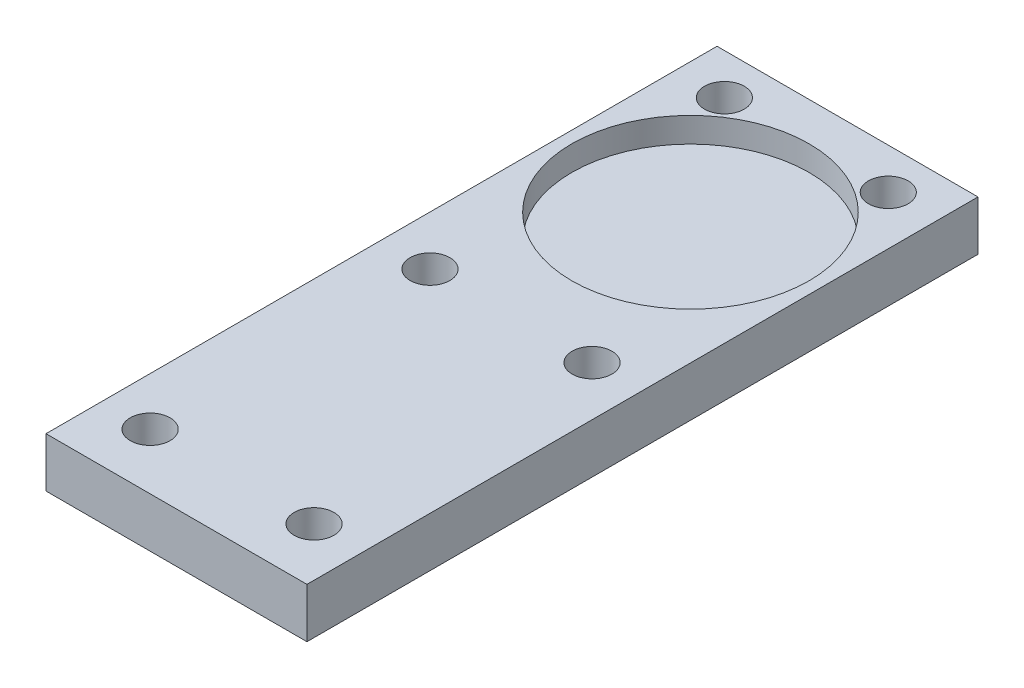
ISO-10303-21;
HEADER;
FILE_DESCRIPTION(('STEP AP214'),'2;1');
FILE_NAME('part.step','',(''),(''),'','','');
FILE_SCHEMA(('AUTOMOTIVE_DESIGN { 1 0 10303 214 1 1 1 1 }'));
ENDSEC;
DATA;
#1=APPLICATION_CONTEXT('core data for automotive mechanical design processes');
#2=APPLICATION_PROTOCOL_DEFINITION('international standard','automotive_design',2000,#1);
#3=PRODUCT_CONTEXT('',#1,'mechanical');
#4=PRODUCT('Part','Part','',(#3));
#5=PRODUCT_RELATED_PRODUCT_CATEGORY('part','',(#4));
#6=PRODUCT_DEFINITION_FORMATION('','',#4);
#7=PRODUCT_DEFINITION_CONTEXT('part definition',#1,'design');
#8=PRODUCT_DEFINITION('design','',#6,#7);
#9=PRODUCT_DEFINITION_SHAPE('','',#8);
#10=(LENGTH_UNIT() NAMED_UNIT(*) SI_UNIT(.MILLI.,.METRE.));
#11=(NAMED_UNIT(*) PLANE_ANGLE_UNIT() SI_UNIT($,.RADIAN.));
#12=(NAMED_UNIT(*) SI_UNIT($,.STERADIAN.) SOLID_ANGLE_UNIT());
#13=UNCERTAINTY_MEASURE_WITH_UNIT(LENGTH_MEASURE(1.E-05),#10,'distance_accuracy_value','');
#14=(GEOMETRIC_REPRESENTATION_CONTEXT(3) GLOBAL_UNCERTAINTY_ASSIGNED_CONTEXT((#13)) GLOBAL_UNIT_ASSIGNED_CONTEXT((#10,
#11,#12)) REPRESENTATION_CONTEXT('',''));
#15=CARTESIAN_POINT('',(0.,0.,0.));
#16=DIRECTION('',(0.,0.,1.));
#17=DIRECTION('',(1.,0.,0.));
#18=AXIS2_PLACEMENT_3D('',#15,#16,#17);
#19=CARTESIAN_POINT('',(0.,-10.9,-54.));
#20=DIRECTION('',(0.,-1.,0.));
#21=DIRECTION('',(1.,0.,0.));
#22=AXIS2_PLACEMENT_3D('',#19,#20,#21);
#23=PLANE('',#22);
#24=CARTESIAN_POINT('',(4.97864683522511,-10.9,-50.71));
#25=DIRECTION('',(0.,-1.,0.));
#26=DIRECTION('',(1.,0.,0.));
#27=AXIS2_PLACEMENT_3D('',#24,#25,#26);
#28=CIRCLE('',#27,1.59999999999999);
#29=CARTESIAN_POINT('',(6.57864683522511,-10.9,-50.71));
#30=VERTEX_POINT('',#29);
#31=EDGE_CURVE('E79',#30,#30,#28,.T.);
#32=ORIENTED_EDGE('',*,*,#31,.T.);
#33=EDGE_LOOP('',(#32));
#34=FACE_BOUND('',#33,.T.);
#35=CARTESIAN_POINT('',(-8.21092728351021,-10.9,-50.71));
#36=DIRECTION('',(0.,-1.,0.));
#37=DIRECTION('',(1.,0.,0.));
#38=AXIS2_PLACEMENT_3D('',#35,#36,#37);
#39=CIRCLE('',#38,1.59999999999999);
#40=CARTESIAN_POINT('',(-6.61092728351022,-10.9,-50.71));
#41=VERTEX_POINT('',#40);
#42=EDGE_CURVE('E165',#41,#41,#39,.T.);
#43=ORIENTED_EDGE('',*,*,#42,.T.);
#44=EDGE_LOOP('',(#43));
#45=FACE_BOUND('',#44,.T.);
#46=CARTESIAN_POINT('',(-8.21092728351021,-10.9,-4.49999999999999));
#47=DIRECTION('',(0.,-1.,0.));
#48=DIRECTION('',(1.,0.,0.));
#49=AXIS2_PLACEMENT_3D('',#46,#47,#48);
#50=CIRCLE('',#49,1.59999999999999);
#51=CARTESIAN_POINT('',(-6.61092728351022,-10.9,-4.49999999999999));
#52=VERTEX_POINT('',#51);
#53=EDGE_CURVE('E161',#52,#52,#50,.T.);
#54=ORIENTED_EDGE('',*,*,#53,.T.);
#55=EDGE_LOOP('',(#54));
#56=FACE_BOUND('',#55,.T.);
#57=CARTESIAN_POINT('',(4.97864683522512,-10.9,-4.49999999999999));
#58=DIRECTION('',(0.,-1.,0.));
#59=DIRECTION('',(1.,0.,0.));
#60=AXIS2_PLACEMENT_3D('',#57,#58,#59);
#61=CIRCLE('',#60,1.59999999999999);
#62=CARTESIAN_POINT('',(6.57864683522511,-10.9,-4.49999999999999));
#63=VERTEX_POINT('',#62);
#64=EDGE_CURVE('E156',#63,#63,#61,.T.);
#65=ORIENTED_EDGE('',*,*,#64,.T.);
#66=EDGE_LOOP('',(#65));
#67=FACE_BOUND('',#66,.T.);
#68=CARTESIAN_POINT('',(-8.11092728351021,-10.9,-26.92));
#69=DIRECTION('',(0.,-1.,0.));
#70=DIRECTION('',(1.,0.,0.));
#71=AXIS2_PLACEMENT_3D('',#68,#69,#70);
#72=CIRCLE('',#71,1.59999999999999);
#73=CARTESIAN_POINT('',(-6.51092728351021,-10.9,-26.92));
#74=VERTEX_POINT('',#73);
#75=EDGE_CURVE('E151',#74,#74,#72,.T.);
#76=ORIENTED_EDGE('',*,*,#75,.T.);
#77=EDGE_LOOP('',(#76));
#78=FACE_BOUND('',#77,.T.);
#79=CARTESIAN_POINT('',(4.92907271648979,-10.9,-26.92));
#80=DIRECTION('',(0.,-1.,0.));
#81=DIRECTION('',(1.,0.,0.));
#82=AXIS2_PLACEMENT_3D('',#79,#80,#81);
#83=CIRCLE('',#82,1.59999999999999);
#84=CARTESIAN_POINT('',(6.52907271648979,-10.9,-26.92));
#85=VERTEX_POINT('',#84);
#86=EDGE_CURVE('E146',#85,#85,#83,.T.);
#87=ORIENTED_EDGE('',*,*,#86,.T.);
#88=EDGE_LOOP('',(#87));
#89=FACE_BOUND('',#88,.T.);
#90=CARTESIAN_POINT('',(-1.5909272835102,-10.9,-41.36));
#91=DIRECTION('',(0.,1.,0.));
#92=DIRECTION('',(-1.,0.,0.));
#93=AXIS2_PLACEMENT_3D('',#90,#91,#92);
#94=CIRCLE('',#93,9.55000000000001);
#95=CARTESIAN_POINT('',(-11.1409272835102,-10.9,-41.36));
#96=VERTEX_POINT('',#95);
#97=EDGE_CURVE('E149',#96,#96,#94,.T.);
#98=ORIENTED_EDGE('',*,*,#97,.F.);
#99=EDGE_LOOP('',(#98));
#100=FACE_BOUND('',#99,.T.);
#101=DIRECTION('',(0.,0.,1.));
#102=VECTOR('',#101,1.);
#103=CARTESIAN_POINT('',(8.9090727164898,-10.9,-54.));
#104=LINE('',#103,#102);
#105=CARTESIAN_POINT('',(8.9090727164898,-10.9,-54.));
#106=VERTEX_POINT('',#105);
#107=CARTESIAN_POINT('',(8.9090727164898,-10.9,0.));
#108=VERTEX_POINT('',#107);
#109=EDGE_CURVE('E12',#106,#108,#104,.T.);
#110=ORIENTED_EDGE('',*,*,#109,.F.);
#111=DIRECTION('',(1.,0.,0.));
#112=VECTOR('',#111,1.);
#113=CARTESIAN_POINT('',(0.,-10.9,-54.));
#114=LINE('',#113,#112);
#115=CARTESIAN_POINT('',(-12.0909272835102,-10.9,-54.));
#116=VERTEX_POINT('',#115);
#117=EDGE_CURVE('E135',#116,#106,#114,.T.);
#118=ORIENTED_EDGE('',*,*,#117,.F.);
#119=DIRECTION('',(0.,0.,1.));
#120=VECTOR('',#119,1.);
#121=CARTESIAN_POINT('',(-12.0909272835102,-10.9,-54.));
#122=LINE('',#121,#120);
#123=CARTESIAN_POINT('',(-12.0909272835102,-10.9,0.));
#124=VERTEX_POINT('',#123);
#125=EDGE_CURVE('E84',#116,#124,#122,.T.);
#126=ORIENTED_EDGE('',*,*,#125,.T.);
#127=DIRECTION('',(1.,0.,0.));
#128=VECTOR('',#127,1.);
#129=CARTESIAN_POINT('',(0.,-10.9,0.));
#130=LINE('',#129,#128);
#131=EDGE_CURVE('E136',#124,#108,#130,.T.);
#132=ORIENTED_EDGE('',*,*,#131,.T.);
#133=EDGE_LOOP('',(#110,#118,#126,#132));
#134=FACE_BOUND('',#133,.T.);
#135=ADVANCED_FACE('F75',(#34,#45,#56,#67,#78,#89,#100,#134),#23,.F.);
#136=CARTESIAN_POINT('',(0.,-14.9,-54.));
#137=DIRECTION('',(0.,1.,0.));
#138=DIRECTION('',(-1.,0.,0.));
#139=AXIS2_PLACEMENT_3D('',#136,#137,#138);
#140=PLANE('',#139);
#141=CARTESIAN_POINT('',(4.97864683522511,-14.9,-50.71));
#142=DIRECTION('',(0.,-1.,0.));
#143=DIRECTION('',(0.,0.,-1.));
#144=AXIS2_PLACEMENT_3D('',#141,#142,#143);
#145=CIRCLE('',#144,3.15);
#146=CARTESIAN_POINT('',(4.97864683522511,-14.9,-53.86));
#147=VERTEX_POINT('',#146);
#148=EDGE_CURVE('E413',#147,#147,#145,.T.);
#149=ORIENTED_EDGE('',*,*,#148,.F.);
#150=EDGE_LOOP('',(#149));
#151=FACE_BOUND('',#150,.T.);
#152=CARTESIAN_POINT('',(-8.21092728351021,-14.9,-50.71));
#153=DIRECTION('',(0.,-1.,0.));
#154=DIRECTION('',(0.,0.,-1.));
#155=AXIS2_PLACEMENT_3D('',#152,#153,#154);
#156=CIRCLE('',#155,3.15);
#157=CARTESIAN_POINT('',(-8.21092728351021,-14.9,-53.86));
#158=VERTEX_POINT('',#157);
#159=EDGE_CURVE('E174',#158,#158,#156,.T.);
#160=ORIENTED_EDGE('',*,*,#159,.F.);
#161=EDGE_LOOP('',(#160));
#162=FACE_BOUND('',#161,.T.);
#163=CARTESIAN_POINT('',(-8.21092728351021,-14.9,-4.49999999999999));
#164=DIRECTION('',(0.,-1.,0.));
#165=DIRECTION('',(0.,0.,-1.));
#166=AXIS2_PLACEMENT_3D('',#163,#164,#165);
#167=CIRCLE('',#166,3.15);
#168=CARTESIAN_POINT('',(-8.21092728351021,-14.9,-7.64999999999999));
#169=VERTEX_POINT('',#168);
#170=EDGE_CURVE('E167',#169,#169,#167,.T.);
#171=ORIENTED_EDGE('',*,*,#170,.F.);
#172=EDGE_LOOP('',(#171));
#173=FACE_BOUND('',#172,.T.);
#174=CARTESIAN_POINT('',(4.97864683522512,-14.9,-4.49999999999999));
#175=DIRECTION('',(0.,-1.,0.));
#176=DIRECTION('',(0.,0.,-1.));
#177=AXIS2_PLACEMENT_3D('',#174,#175,#176);
#178=CIRCLE('',#177,3.15);
#179=CARTESIAN_POINT('',(4.97864683522512,-14.9,-7.64999999999999));
#180=VERTEX_POINT('',#179);
#181=EDGE_CURVE('E163',#180,#180,#178,.T.);
#182=ORIENTED_EDGE('',*,*,#181,.F.);
#183=EDGE_LOOP('',(#182));
#184=FACE_BOUND('',#183,.T.);
#185=CARTESIAN_POINT('',(-8.11092728351021,-14.9,-26.92));
#186=DIRECTION('',(0.,-1.,0.));
#187=DIRECTION('',(0.,0.,-1.));
#188=AXIS2_PLACEMENT_3D('',#185,#186,#187);
#189=CIRCLE('',#188,3.15);
#190=CARTESIAN_POINT('',(-8.11092728351021,-14.9,-30.07));
#191=VERTEX_POINT('',#190);
#192=EDGE_CURVE('E130',#191,#191,#189,.T.);
#193=ORIENTED_EDGE('',*,*,#192,.F.);
#194=EDGE_LOOP('',(#193));
#195=FACE_BOUND('',#194,.T.);
#196=CARTESIAN_POINT('',(4.92907271648979,-14.9,-26.92));
#197=DIRECTION('',(0.,-1.,0.));
#198=DIRECTION('',(0.,0.,-1.));
#199=AXIS2_PLACEMENT_3D('',#196,#197,#198);
#200=CIRCLE('',#199,3.15);
#201=CARTESIAN_POINT('',(4.92907271648979,-14.9,-30.07));
#202=VERTEX_POINT('',#201);
#203=EDGE_CURVE('E154',#202,#202,#200,.T.);
#204=ORIENTED_EDGE('',*,*,#203,.F.);
#205=EDGE_LOOP('',(#204));
#206=FACE_BOUND('',#205,.T.);
#207=DIRECTION('',(-1.,0.,0.));
#208=VECTOR('',#207,1.);
#209=CARTESIAN_POINT('',(0.,-14.9,0.));
#210=LINE('',#209,#208);
#211=CARTESIAN_POINT('',(8.9090727164898,-14.9,0.));
#212=VERTEX_POINT('',#211);
#213=CARTESIAN_POINT('',(-12.0909272835102,-14.9,0.));
#214=VERTEX_POINT('',#213);
#215=EDGE_CURVE('E129',#212,#214,#210,.T.);
#216=ORIENTED_EDGE('',*,*,#215,.T.);
#217=DIRECTION('',(0.,0.,1.));
#218=VECTOR('',#217,1.);
#219=CARTESIAN_POINT('',(-12.0909272835102,-14.9,-54.));
#220=LINE('',#219,#218);
#221=CARTESIAN_POINT('',(-12.0909272835102,-14.9,-54.));
#222=VERTEX_POINT('',#221);
#223=EDGE_CURVE('E92',#222,#214,#220,.T.);
#224=ORIENTED_EDGE('',*,*,#223,.F.);
#225=DIRECTION('',(-1.,0.,0.));
#226=VECTOR('',#225,1.);
#227=CARTESIAN_POINT('',(0.,-14.9,-54.));
#228=LINE('',#227,#226);
#229=CARTESIAN_POINT('',(8.9090727164898,-14.9,-54.));
#230=VERTEX_POINT('',#229);
#231=EDGE_CURVE('E127',#230,#222,#228,.T.);
#232=ORIENTED_EDGE('',*,*,#231,.F.);
#233=DIRECTION('',(0.,0.,1.));
#234=VECTOR('',#233,1.);
#235=CARTESIAN_POINT('',(8.9090727164898,-14.9,-54.));
#236=LINE('',#235,#234);
#237=EDGE_CURVE('E188',#230,#212,#236,.T.);
#238=ORIENTED_EDGE('',*,*,#237,.T.);
#239=EDGE_LOOP('',(#216,#224,#232,#238));
#240=FACE_BOUND('',#239,.T.);
#241=ADVANCED_FACE('F77',(#151,#162,#173,#184,#195,#206,#240),#140,.F.);
#242=CARTESIAN_POINT('',(0.,0.,-54.));
#243=DIRECTION('',(0.,0.,1.));
#244=DIRECTION('',(1.,0.,0.));
#245=AXIS2_PLACEMENT_3D('',#242,#243,#244);
#246=PLANE('',#245);
#247=ORIENTED_EDGE('',*,*,#231,.T.);
#248=DIRECTION('',(0.,1.,0.));
#249=VECTOR('',#248,1.);
#250=CARTESIAN_POINT('',(-12.0909272835102,-14.9,-54.));
#251=LINE('',#250,#249);
#252=EDGE_CURVE('E114',#222,#116,#251,.T.);
#253=ORIENTED_EDGE('',*,*,#252,.T.);
#254=ORIENTED_EDGE('',*,*,#117,.T.);
#255=DIRECTION('',(0.,-1.,0.));
#256=VECTOR('',#255,1.);
#257=CARTESIAN_POINT('',(8.9090727164898,-14.9,-54.));
#258=LINE('',#257,#256);
#259=EDGE_CURVE('E134',#106,#230,#258,.T.);
#260=ORIENTED_EDGE('',*,*,#259,.T.);
#261=EDGE_LOOP('',(#247,#253,#254,#260));
#262=FACE_BOUND('',#261,.T.);
#263=ADVANCED_FACE('F133',(#262),#246,.F.);
#264=CARTESIAN_POINT('',(0.,0.,0.));
#265=DIRECTION('',(0.,0.,1.));
#266=DIRECTION('',(1.,0.,0.));
#267=AXIS2_PLACEMENT_3D('',#264,#265,#266);
#268=PLANE('',#267);
#269=DIRECTION('',(0.,1.,0.));
#270=VECTOR('',#269,1.);
#271=CARTESIAN_POINT('',(-12.0909272835102,-14.9,0.));
#272=LINE('',#271,#270);
#273=EDGE_CURVE('E121',#214,#124,#272,.T.);
#274=ORIENTED_EDGE('',*,*,#273,.F.);
#275=ORIENTED_EDGE('',*,*,#215,.F.);
#276=DIRECTION('',(0.,-1.,0.));
#277=VECTOR('',#276,1.);
#278=CARTESIAN_POINT('',(8.9090727164898,-14.9,0.));
#279=LINE('',#278,#277);
#280=EDGE_CURVE('E159',#108,#212,#279,.T.);
#281=ORIENTED_EDGE('',*,*,#280,.F.);
#282=ORIENTED_EDGE('',*,*,#131,.F.);
#283=EDGE_LOOP('',(#274,#275,#281,#282));
#284=FACE_BOUND('',#283,.T.);
#285=ADVANCED_FACE('F212',(#284),#268,.T.);
#286=CARTESIAN_POINT('',(-1.5909272835102,-12.9,-41.36));
#287=DIRECTION('',(0.,1.,0.));
#288=DIRECTION('',(-1.,0.,0.));
#289=AXIS2_PLACEMENT_3D('',#286,#287,#288);
#290=CYLINDRICAL_SURFACE('',#289,9.55000000000001);
#291=CARTESIAN_POINT('',(-1.5909272835102,-12.9,-41.36));
#292=DIRECTION('',(0.,1.,0.));
#293=DIRECTION('',(-1.,0.,0.));
#294=AXIS2_PLACEMENT_3D('',#291,#292,#293);
#295=CIRCLE('',#294,9.55000000000001);
#296=CARTESIAN_POINT('',(-11.1409272835102,-12.9,-41.36));
#297=VERTEX_POINT('',#296);
#298=EDGE_CURVE('E144',#297,#297,#295,.T.);
#299=ORIENTED_EDGE('',*,*,#298,.F.);
#300=EDGE_LOOP('',(#299));
#301=FACE_BOUND('',#300,.T.);
#302=ORIENTED_EDGE('',*,*,#97,.T.);
#303=EDGE_LOOP('',(#302));
#304=FACE_BOUND('',#303,.T.);
#305=ADVANCED_FACE('F205',(#301,#304),#290,.F.);
#306=CARTESIAN_POINT('',(-1.5909272835102,-12.9,-41.36));
#307=DIRECTION('',(0.,1.,0.));
#308=DIRECTION('',(-1.,0.,0.));
#309=AXIS2_PLACEMENT_3D('',#306,#307,#308);
#310=PLANE('',#309);
#311=ORIENTED_EDGE('',*,*,#298,.T.);
#312=EDGE_LOOP('',(#311));
#313=FACE_BOUND('',#312,.T.);
#314=ADVANCED_FACE('F238',(#313),#310,.T.);
#315=CARTESIAN_POINT('',(4.92907271648979,-14.9,-26.92));
#316=DIRECTION('',(0.,-1.,0.));
#317=DIRECTION('',(0.,0.,-1.));
#318=AXIS2_PLACEMENT_3D('',#315,#316,#317);
#319=CYLINDRICAL_SURFACE('',#318,1.59999999999999);
#320=CARTESIAN_POINT('',(4.92907271648979,-13.35,-26.92));
#321=DIRECTION('',(0.,-1.,0.));
#322=DIRECTION('',(0.,0.,-1.));
#323=AXIS2_PLACEMENT_3D('',#320,#321,#322);
#324=CIRCLE('',#323,1.59999999999999);
#325=CARTESIAN_POINT('',(4.92907271648979,-13.35,-28.52));
#326=VERTEX_POINT('',#325);
#327=EDGE_CURVE('E150',#326,#326,#324,.T.);
#328=ORIENTED_EDGE('',*,*,#327,.T.);
#329=EDGE_LOOP('',(#328));
#330=FACE_BOUND('',#329,.T.);
#331=ORIENTED_EDGE('',*,*,#86,.F.);
#332=EDGE_LOOP('',(#331));
#333=FACE_BOUND('',#332,.T.);
#334=ADVANCED_FACE('F234',(#330,#333),#319,.F.);
#335=CARTESIAN_POINT('',(4.92907271648979,-14.9,-26.92));
#336=DIRECTION('',(0.,-1.,0.));
#337=DIRECTION('',(0.,0.,-1.));
#338=AXIS2_PLACEMENT_3D('',#335,#336,#337);
#339=CONICAL_SURFACE('',#338,3.15,0.785398163397453);
#340=ORIENTED_EDGE('',*,*,#327,.F.);
#341=EDGE_LOOP('',(#340));
#342=FACE_BOUND('',#341,.T.);
#343=ORIENTED_EDGE('',*,*,#203,.T.);
#344=EDGE_LOOP('',(#343));
#345=FACE_BOUND('',#344,.T.);
#346=ADVANCED_FACE('F230',(#342,#345),#339,.F.);
#347=CARTESIAN_POINT('',(-8.11092728351021,-14.9,-26.92));
#348=DIRECTION('',(0.,-1.,0.));
#349=DIRECTION('',(0.,0.,-1.));
#350=AXIS2_PLACEMENT_3D('',#347,#348,#349);
#351=CYLINDRICAL_SURFACE('',#350,1.59999999999999);
#352=CARTESIAN_POINT('',(-8.11092728351021,-13.35,-26.92));
#353=DIRECTION('',(0.,-1.,0.));
#354=DIRECTION('',(0.,0.,-1.));
#355=AXIS2_PLACEMENT_3D('',#352,#353,#354);
#356=CIRCLE('',#355,1.59999999999999);
#357=CARTESIAN_POINT('',(-8.11092728351021,-13.35,-28.52));
#358=VERTEX_POINT('',#357);
#359=EDGE_CURVE('E155',#358,#358,#356,.T.);
#360=ORIENTED_EDGE('',*,*,#359,.T.);
#361=EDGE_LOOP('',(#360));
#362=FACE_BOUND('',#361,.T.);
#363=ORIENTED_EDGE('',*,*,#75,.F.);
#364=EDGE_LOOP('',(#363));
#365=FACE_BOUND('',#364,.T.);
#366=ADVANCED_FACE('F223',(#362,#365),#351,.F.);
#367=CARTESIAN_POINT('',(-8.11092728351021,-14.9,-26.92));
#368=DIRECTION('',(0.,-1.,0.));
#369=DIRECTION('',(0.,0.,-1.));
#370=AXIS2_PLACEMENT_3D('',#367,#368,#369);
#371=CONICAL_SURFACE('',#370,3.15,0.785398163397453);
#372=ORIENTED_EDGE('',*,*,#359,.F.);
#373=EDGE_LOOP('',(#372));
#374=FACE_BOUND('',#373,.T.);
#375=ORIENTED_EDGE('',*,*,#192,.T.);
#376=EDGE_LOOP('',(#375));
#377=FACE_BOUND('',#376,.T.);
#378=ADVANCED_FACE('F215',(#374,#377),#371,.F.);
#379=CARTESIAN_POINT('',(8.9090727164898,-14.9,-54.));
#380=DIRECTION('',(-1.,0.,0.));
#381=DIRECTION('',(0.,0.,1.));
#382=AXIS2_PLACEMENT_3D('',#379,#380,#381);
#383=PLANE('',#382);
#384=ORIENTED_EDGE('',*,*,#280,.T.);
#385=ORIENTED_EDGE('',*,*,#237,.F.);
#386=ORIENTED_EDGE('',*,*,#259,.F.);
#387=ORIENTED_EDGE('',*,*,#109,.T.);
#388=EDGE_LOOP('',(#384,#385,#386,#387));
#389=FACE_BOUND('',#388,.T.);
#390=ADVANCED_FACE('F213',(#389),#383,.F.);
#391=CARTESIAN_POINT('',(-12.0909272835102,-14.9,-54.));
#392=DIRECTION('',(1.,0.,0.));
#393=DIRECTION('',(0.,0.,-1.));
#394=AXIS2_PLACEMENT_3D('',#391,#392,#393);
#395=PLANE('',#394);
#396=ORIENTED_EDGE('',*,*,#252,.F.);
#397=ORIENTED_EDGE('',*,*,#223,.T.);
#398=ORIENTED_EDGE('',*,*,#273,.T.);
#399=ORIENTED_EDGE('',*,*,#125,.F.);
#400=EDGE_LOOP('',(#396,#397,#398,#399));
#401=FACE_BOUND('',#400,.T.);
#402=ADVANCED_FACE('F115',(#401),#395,.F.);
#403=CARTESIAN_POINT('',(4.97864683522512,-14.9,-4.49999999999999));
#404=DIRECTION('',(0.,-1.,0.));
#405=DIRECTION('',(0.,0.,-1.));
#406=AXIS2_PLACEMENT_3D('',#403,#404,#405);
#407=CYLINDRICAL_SURFACE('',#406,1.59999999999999);
#408=CARTESIAN_POINT('',(4.97864683522512,-13.35,-4.49999999999999));
#409=DIRECTION('',(0.,-1.,0.));
#410=DIRECTION('',(0.,0.,-1.));
#411=AXIS2_PLACEMENT_3D('',#408,#409,#410);
#412=CIRCLE('',#411,1.6);
#413=CARTESIAN_POINT('',(4.97864683522512,-13.35,-6.09999999999999));
#414=VERTEX_POINT('',#413);
#415=EDGE_CURVE('E160',#414,#414,#412,.T.);
#416=ORIENTED_EDGE('',*,*,#415,.T.);
#417=EDGE_LOOP('',(#416));
#418=FACE_BOUND('',#417,.T.);
#419=ORIENTED_EDGE('',*,*,#64,.F.);
#420=EDGE_LOOP('',(#419));
#421=FACE_BOUND('',#420,.T.);
#422=ADVANCED_FACE('F221',(#418,#421),#407,.F.);
#423=CARTESIAN_POINT('',(4.97864683522512,-14.9,-4.49999999999999));
#424=DIRECTION('',(0.,-1.,0.));
#425=DIRECTION('',(0.,0.,-1.));
#426=AXIS2_PLACEMENT_3D('',#423,#424,#425);
#427=CONICAL_SURFACE('',#426,3.15,0.785398163397448);
#428=ORIENTED_EDGE('',*,*,#415,.F.);
#429=EDGE_LOOP('',(#428));
#430=FACE_BOUND('',#429,.T.);
#431=ORIENTED_EDGE('',*,*,#181,.T.);
#432=EDGE_LOOP('',(#431));
#433=FACE_BOUND('',#432,.T.);
#434=ADVANCED_FACE('F335',(#430,#433),#427,.F.);
#435=CARTESIAN_POINT('',(-8.21092728351021,-14.9,-4.49999999999999));
#436=DIRECTION('',(0.,-1.,0.));
#437=DIRECTION('',(0.,0.,-1.));
#438=AXIS2_PLACEMENT_3D('',#435,#436,#437);
#439=CYLINDRICAL_SURFACE('',#438,1.59999999999999);
#440=CARTESIAN_POINT('',(-8.21092728351021,-13.35,-4.49999999999999));
#441=DIRECTION('',(0.,-1.,0.));
#442=DIRECTION('',(0.,0.,-1.));
#443=AXIS2_PLACEMENT_3D('',#440,#441,#442);
#444=CIRCLE('',#443,1.6);
#445=CARTESIAN_POINT('',(-8.21092728351021,-13.35,-6.09999999999999));
#446=VERTEX_POINT('',#445);
#447=EDGE_CURVE('E164',#446,#446,#444,.T.);
#448=ORIENTED_EDGE('',*,*,#447,.T.);
#449=EDGE_LOOP('',(#448));
#450=FACE_BOUND('',#449,.T.);
#451=ORIENTED_EDGE('',*,*,#53,.F.);
#452=EDGE_LOOP('',(#451));
#453=FACE_BOUND('',#452,.T.);
#454=ADVANCED_FACE('F341',(#450,#453),#439,.F.);
#455=CARTESIAN_POINT('',(-8.21092728351021,-14.9,-4.49999999999999));
#456=DIRECTION('',(0.,-1.,0.));
#457=DIRECTION('',(0.,0.,-1.));
#458=AXIS2_PLACEMENT_3D('',#455,#456,#457);
#459=CONICAL_SURFACE('',#458,3.15,0.785398163397448);
#460=ORIENTED_EDGE('',*,*,#447,.F.);
#461=EDGE_LOOP('',(#460));
#462=FACE_BOUND('',#461,.T.);
#463=ORIENTED_EDGE('',*,*,#170,.T.);
#464=EDGE_LOOP('',(#463));
#465=FACE_BOUND('',#464,.T.);
#466=ADVANCED_FACE('F349',(#462,#465),#459,.F.);
#467=CARTESIAN_POINT('',(-8.21092728351021,-14.9,-50.71));
#468=DIRECTION('',(0.,-1.,0.));
#469=DIRECTION('',(0.,0.,-1.));
#470=AXIS2_PLACEMENT_3D('',#467,#468,#469);
#471=CYLINDRICAL_SURFACE('',#470,1.59999999999999);
#472=CARTESIAN_POINT('',(-8.21092728351021,-13.35,-50.71));
#473=DIRECTION('',(0.,-1.,0.));
#474=DIRECTION('',(0.,0.,-1.));
#475=AXIS2_PLACEMENT_3D('',#472,#473,#474);
#476=CIRCLE('',#475,1.6);
#477=CARTESIAN_POINT('',(-8.21092728351021,-13.35,-52.31));
#478=VERTEX_POINT('',#477);
#479=EDGE_CURVE('E168',#478,#478,#476,.T.);
#480=ORIENTED_EDGE('',*,*,#479,.T.);
#481=EDGE_LOOP('',(#480));
#482=FACE_BOUND('',#481,.T.);
#483=ORIENTED_EDGE('',*,*,#42,.F.);
#484=EDGE_LOOP('',(#483));
#485=FACE_BOUND('',#484,.T.);
#486=ADVANCED_FACE('F357',(#482,#485),#471,.F.);
#487=CARTESIAN_POINT('',(-8.21092728351021,-14.9,-50.71));
#488=DIRECTION('',(0.,-1.,0.));
#489=DIRECTION('',(0.,0.,-1.));
#490=AXIS2_PLACEMENT_3D('',#487,#488,#489);
#491=CONICAL_SURFACE('',#490,3.15,0.785398163397448);
#492=ORIENTED_EDGE('',*,*,#479,.F.);
#493=EDGE_LOOP('',(#492));
#494=FACE_BOUND('',#493,.T.);
#495=ORIENTED_EDGE('',*,*,#159,.T.);
#496=EDGE_LOOP('',(#495));
#497=FACE_BOUND('',#496,.T.);
#498=ADVANCED_FACE('F365',(#494,#497),#491,.F.);
#499=CARTESIAN_POINT('',(4.97864683522511,-14.9,-50.71));
#500=DIRECTION('',(0.,-1.,0.));
#501=DIRECTION('',(0.,0.,-1.));
#502=AXIS2_PLACEMENT_3D('',#499,#500,#501);
#503=CYLINDRICAL_SURFACE('',#502,1.59999999999999);
#504=CARTESIAN_POINT('',(4.97864683522511,-13.35,-50.71));
#505=DIRECTION('',(0.,-1.,0.));
#506=DIRECTION('',(0.,0.,-1.));
#507=AXIS2_PLACEMENT_3D('',#504,#505,#506);
#508=CIRCLE('',#507,1.6);
#509=CARTESIAN_POINT('',(4.97864683522511,-13.35,-52.31));
#510=VERTEX_POINT('',#509);
#511=EDGE_CURVE('E410',#510,#510,#508,.T.);
#512=ORIENTED_EDGE('',*,*,#511,.T.);
#513=EDGE_LOOP('',(#512));
#514=FACE_BOUND('',#513,.T.);
#515=ORIENTED_EDGE('',*,*,#31,.F.);
#516=EDGE_LOOP('',(#515));
#517=FACE_BOUND('',#516,.T.);
#518=ADVANCED_FACE('F372',(#514,#517),#503,.F.);
#519=CARTESIAN_POINT('',(4.97864683522511,-14.9,-50.71));
#520=DIRECTION('',(0.,-1.,0.));
#521=DIRECTION('',(0.,0.,-1.));
#522=AXIS2_PLACEMENT_3D('',#519,#520,#521);
#523=CONICAL_SURFACE('',#522,3.15,0.785398163397448);
#524=ORIENTED_EDGE('',*,*,#511,.F.);
#525=EDGE_LOOP('',(#524));
#526=FACE_BOUND('',#525,.T.);
#527=ORIENTED_EDGE('',*,*,#148,.T.);
#528=EDGE_LOOP('',(#527));
#529=FACE_BOUND('',#528,.T.);
#530=ADVANCED_FACE('F380',(#526,#529),#523,.F.);
#531=CLOSED_SHELL('',(#135,#241,#263,#285,#305,#314,#334,#346,#366,#378,#390,#402,#422,#434,
#454,#466,#486,#498,#518,#530));
#532=MANIFOLD_SOLID_BREP('B2',#531);
#533=ADVANCED_BREP_SHAPE_REPRESENTATION('',(#18,#532),#14);
#534=SHAPE_DEFINITION_REPRESENTATION(#9,#533);
ENDSEC;
END-ISO-10303-21;
